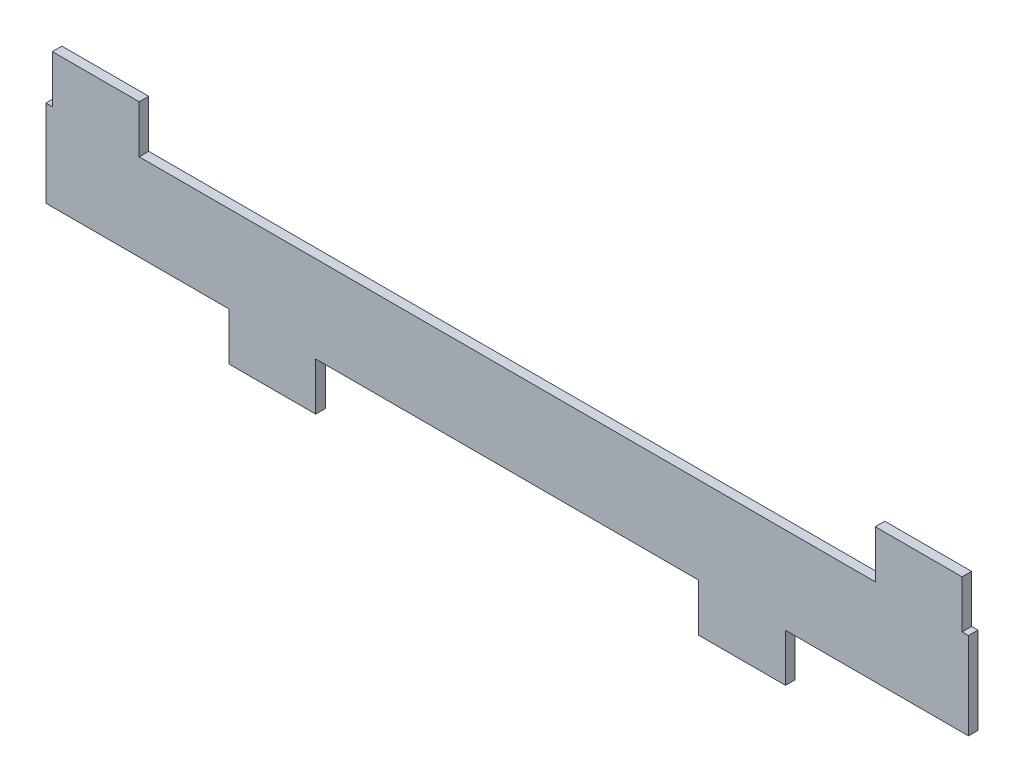
ISO-10303-21;
HEADER;
FILE_DESCRIPTION(('STEP AP214'),'2;1');
FILE_NAME('part.step','',(''),(''),'','','');
FILE_SCHEMA(('AUTOMOTIVE_DESIGN { 1 0 10303 214 1 1 1 1 }'));
ENDSEC;
DATA;
#1=APPLICATION_CONTEXT('core data for automotive mechanical design processes');
#2=APPLICATION_PROTOCOL_DEFINITION('international standard','automotive_design',2000,#1);
#3=PRODUCT_CONTEXT('',#1,'mechanical');
#4=PRODUCT('Part','Part','',(#3));
#5=PRODUCT_RELATED_PRODUCT_CATEGORY('part','',(#4));
#6=PRODUCT_DEFINITION_FORMATION('','',#4);
#7=PRODUCT_DEFINITION_CONTEXT('part definition',#1,'design');
#8=PRODUCT_DEFINITION('design','',#6,#7);
#9=PRODUCT_DEFINITION_SHAPE('','',#8);
#10=(LENGTH_UNIT() NAMED_UNIT(*) SI_UNIT(.MILLI.,.METRE.));
#11=(NAMED_UNIT(*) PLANE_ANGLE_UNIT() SI_UNIT($,.RADIAN.));
#12=(NAMED_UNIT(*) SI_UNIT($,.STERADIAN.) SOLID_ANGLE_UNIT());
#13=UNCERTAINTY_MEASURE_WITH_UNIT(LENGTH_MEASURE(1.E-05),#10,'distance_accuracy_value','');
#14=(GEOMETRIC_REPRESENTATION_CONTEXT(3) GLOBAL_UNCERTAINTY_ASSIGNED_CONTEXT((#13)) GLOBAL_UNIT_ASSIGNED_CONTEXT((#10,
#11,#12)) REPRESENTATION_CONTEXT('',''));
#15=CARTESIAN_POINT('',(0.,0.,0.));
#16=DIRECTION('',(0.,0.,1.));
#17=DIRECTION('',(1.,0.,0.));
#18=AXIS2_PLACEMENT_3D('',#15,#16,#17);
#19=CARTESIAN_POINT('',(64.6216856989642,114.1001191742,3.));
#20=DIRECTION('',(1.,0.,0.));
#21=DIRECTION('',(0.,0.,-1.));
#22=AXIS2_PLACEMENT_3D('',#19,#20,#21);
#23=PLANE('',#22);
#24=DIRECTION('',(0.,-1.,0.));
#25=VECTOR('',#24,1.);
#26=CARTESIAN_POINT('',(64.6216856989642,114.1001191742,0.));
#27=LINE('',#26,#25);
#28=CARTESIAN_POINT('',(64.6216856989642,114.1001191742,0.));
#29=VERTEX_POINT('',#28);
#30=CARTESIAN_POINT('',(64.6216856989642,99.1001191742,0.));
#31=VERTEX_POINT('',#30);
#32=EDGE_CURVE('E206',#29,#31,#27,.T.);
#33=ORIENTED_EDGE('',*,*,#32,.F.);
#34=DIRECTION('',(0.,0.,-1.));
#35=VECTOR('',#34,1.);
#36=CARTESIAN_POINT('',(64.6216856989642,114.1001191742,3.));
#37=LINE('',#36,#35);
#38=CARTESIAN_POINT('',(64.6216856989642,114.1001191742,3.));
#39=VERTEX_POINT('',#38);
#40=EDGE_CURVE('E11',#39,#29,#37,.T.);
#41=ORIENTED_EDGE('',*,*,#40,.F.);
#42=DIRECTION('',(0.,-1.,0.));
#43=VECTOR('',#42,1.);
#44=CARTESIAN_POINT('',(64.6216856989642,114.1001191742,3.));
#45=LINE('',#44,#43);
#46=CARTESIAN_POINT('',(64.6216856989642,99.1001191742,3.));
#47=VERTEX_POINT('',#46);
#48=EDGE_CURVE('E255',#39,#47,#45,.T.);
#49=ORIENTED_EDGE('',*,*,#48,.T.);
#50=DIRECTION('',(0.,0.,-1.));
#51=VECTOR('',#50,1.);
#52=CARTESIAN_POINT('',(64.6216856989642,99.1001191742,3.));
#53=LINE('',#52,#51);
#54=EDGE_CURVE('E39',#47,#31,#53,.T.);
#55=ORIENTED_EDGE('',*,*,#54,.T.);
#56=EDGE_LOOP('',(#33,#41,#49,#55));
#57=FACE_BOUND('',#56,.T.);
#58=ADVANCED_FACE('F36',(#57),#23,.T.);
#59=CARTESIAN_POINT('',(64.6216856989642,114.1001191742,3.));
#60=DIRECTION('',(0.,-1.,0.));
#61=DIRECTION('',(1.,0.,0.));
#62=AXIS2_PLACEMENT_3D('',#59,#60,#61);
#63=PLANE('',#62);
#64=DIRECTION('',(-1.,0.,0.));
#65=VECTOR('',#64,1.);
#66=CARTESIAN_POINT('',(64.6216856989642,114.1001191742,0.));
#67=LINE('',#66,#65);
#68=CARTESIAN_POINT('',(37.3216856989642,114.1001191742,0.));
#69=VERTEX_POINT('',#68);
#70=EDGE_CURVE('E117',#29,#69,#67,.T.);
#71=ORIENTED_EDGE('',*,*,#70,.T.);
#72=DIRECTION('',(0.,0.,-1.));
#73=VECTOR('',#72,1.);
#74=CARTESIAN_POINT('',(37.3216856989642,114.1001191742,3.));
#75=LINE('',#74,#73);
#76=CARTESIAN_POINT('',(37.3216856989642,114.1001191742,3.));
#77=VERTEX_POINT('',#76);
#78=EDGE_CURVE('E45',#77,#69,#75,.T.);
#79=ORIENTED_EDGE('',*,*,#78,.F.);
#80=DIRECTION('',(-1.,0.,0.));
#81=VECTOR('',#80,1.);
#82=CARTESIAN_POINT('',(64.6216856989642,114.1001191742,3.));
#83=LINE('',#82,#81);
#84=EDGE_CURVE('E184',#39,#77,#83,.T.);
#85=ORIENTED_EDGE('',*,*,#84,.F.);
#86=ORIENTED_EDGE('',*,*,#40,.T.);
#87=EDGE_LOOP('',(#71,#79,#85,#86));
#88=FACE_BOUND('',#87,.T.);
#89=ADVANCED_FACE('F407',(#88),#63,.F.);
#90=CARTESIAN_POINT('',(37.3216856989642,114.1001191742,3.));
#91=DIRECTION('',(1.,0.,0.));
#92=DIRECTION('',(0.,0.,-1.));
#93=AXIS2_PLACEMENT_3D('',#90,#91,#92);
#94=PLANE('',#93);
#95=DIRECTION('',(0.,-1.,0.));
#96=VECTOR('',#95,1.);
#97=CARTESIAN_POINT('',(37.3216856989642,114.1001191742,0.));
#98=LINE('',#97,#96);
#99=CARTESIAN_POINT('',(37.3216856989642,99.1001191742,0.));
#100=VERTEX_POINT('',#99);
#101=EDGE_CURVE('E191',#69,#100,#98,.T.);
#102=ORIENTED_EDGE('',*,*,#101,.T.);
#103=DIRECTION('',(0.,0.,-1.));
#104=VECTOR('',#103,1.);
#105=CARTESIAN_POINT('',(37.3216856989642,99.1001191742,3.));
#106=LINE('',#105,#104);
#107=CARTESIAN_POINT('',(37.3216856989642,99.1001191742,3.));
#108=VERTEX_POINT('',#107);
#109=EDGE_CURVE('E188',#108,#100,#106,.T.);
#110=ORIENTED_EDGE('',*,*,#109,.F.);
#111=DIRECTION('',(0.,-1.,0.));
#112=VECTOR('',#111,1.);
#113=CARTESIAN_POINT('',(37.3216856989642,114.1001191742,3.));
#114=LINE('',#113,#112);
#115=EDGE_CURVE('E177',#77,#108,#114,.T.);
#116=ORIENTED_EDGE('',*,*,#115,.F.);
#117=ORIENTED_EDGE('',*,*,#78,.T.);
#118=EDGE_LOOP('',(#102,#110,#116,#117));
#119=FACE_BOUND('',#118,.T.);
#120=ADVANCED_FACE('F189',(#119),#94,.F.);
#121=CARTESIAN_POINT('',(37.3216856989642,99.1001191742,3.));
#122=DIRECTION('',(0.,-1.,0.));
#123=DIRECTION('',(0.,0.,-1.));
#124=AXIS2_PLACEMENT_3D('',#121,#122,#123);
#125=PLANE('',#124);
#126=DIRECTION('',(-1.,0.,0.));
#127=VECTOR('',#126,1.);
#128=CARTESIAN_POINT('',(37.3216856989642,99.1001191742,0.));
#129=LINE('',#128,#127);
#130=CARTESIAN_POINT('',(35.3216856989642,99.1001191742,0.));
#131=VERTEX_POINT('',#130);
#132=EDGE_CURVE('E252',#100,#131,#129,.T.);
#133=ORIENTED_EDGE('',*,*,#132,.T.);
#134=DIRECTION('',(0.,0.,-1.));
#135=VECTOR('',#134,1.);
#136=CARTESIAN_POINT('',(35.3216856989642,99.1001191742,3.));
#137=LINE('',#136,#135);
#138=CARTESIAN_POINT('',(35.3216856989642,99.1001191742,3.));
#139=VERTEX_POINT('',#138);
#140=EDGE_CURVE('E194',#139,#131,#137,.T.);
#141=ORIENTED_EDGE('',*,*,#140,.F.);
#142=DIRECTION('',(-1.,0.,0.));
#143=VECTOR('',#142,1.);
#144=CARTESIAN_POINT('',(37.3216856989642,99.1001191742,3.));
#145=LINE('',#144,#143);
#146=EDGE_CURVE('E182',#108,#139,#145,.T.);
#147=ORIENTED_EDGE('',*,*,#146,.F.);
#148=ORIENTED_EDGE('',*,*,#109,.T.);
#149=EDGE_LOOP('',(#133,#141,#147,#148));
#150=FACE_BOUND('',#149,.T.);
#151=ADVANCED_FACE('F196',(#150),#125,.F.);
#152=CARTESIAN_POINT('',(35.3216856989642,99.1001191742,3.));
#153=DIRECTION('',(1.,0.,0.));
#154=DIRECTION('',(0.,0.,-1.));
#155=AXIS2_PLACEMENT_3D('',#152,#153,#154);
#156=PLANE('',#155);
#157=DIRECTION('',(0.,-1.,0.));
#158=VECTOR('',#157,1.);
#159=CARTESIAN_POINT('',(35.3216856989642,99.1001191742,0.));
#160=LINE('',#159,#158);
#161=CARTESIAN_POINT('',(35.3216856989642,71.8001191742,0.));
#162=VERTEX_POINT('',#161);
#163=EDGE_CURVE('E250',#131,#162,#160,.T.);
#164=ORIENTED_EDGE('',*,*,#163,.T.);
#165=DIRECTION('',(0.,0.,-1.));
#166=VECTOR('',#165,1.);
#167=CARTESIAN_POINT('',(35.3216856989642,71.8001191742,3.));
#168=LINE('',#167,#166);
#169=CARTESIAN_POINT('',(35.3216856989642,71.8001191742,3.));
#170=VERTEX_POINT('',#169);
#171=EDGE_CURVE('E259',#170,#162,#168,.T.);
#172=ORIENTED_EDGE('',*,*,#171,.F.);
#173=DIRECTION('',(0.,-1.,0.));
#174=VECTOR('',#173,1.);
#175=CARTESIAN_POINT('',(35.3216856989642,99.1001191742,3.));
#176=LINE('',#175,#174);
#177=EDGE_CURVE('E199',#139,#170,#176,.T.);
#178=ORIENTED_EDGE('',*,*,#177,.F.);
#179=ORIENTED_EDGE('',*,*,#140,.T.);
#180=EDGE_LOOP('',(#164,#172,#178,#179));
#181=FACE_BOUND('',#180,.T.);
#182=ADVANCED_FACE('F299',(#181),#156,.F.);
#183=CARTESIAN_POINT('',(35.3216856989642,71.8001191742,3.));
#184=DIRECTION('',(0.,1.,0.));
#185=DIRECTION('',(0.,0.,1.));
#186=AXIS2_PLACEMENT_3D('',#183,#184,#185);
#187=PLANE('',#186);
#188=DIRECTION('',(1.,0.,0.));
#189=VECTOR('',#188,1.);
#190=CARTESIAN_POINT('',(35.3216856989642,71.8001191742,0.));
#191=LINE('',#190,#189);
#192=CARTESIAN_POINT('',(92.8216856989642,71.8001191742,0.));
#193=VERTEX_POINT('',#192);
#194=EDGE_CURVE('E248',#162,#193,#191,.T.);
#195=ORIENTED_EDGE('',*,*,#194,.T.);
#196=DIRECTION('',(0.,0.,-1.));
#197=VECTOR('',#196,1.);
#198=CARTESIAN_POINT('',(92.8216856989642,71.8001191742,3.));
#199=LINE('',#198,#197);
#200=CARTESIAN_POINT('',(92.8216856989642,71.8001191742,3.));
#201=VERTEX_POINT('',#200);
#202=EDGE_CURVE('E262',#201,#193,#199,.T.);
#203=ORIENTED_EDGE('',*,*,#202,.F.);
#204=DIRECTION('',(1.,0.,0.));
#205=VECTOR('',#204,1.);
#206=CARTESIAN_POINT('',(35.3216856989642,71.8001191742,3.));
#207=LINE('',#206,#205);
#208=EDGE_CURVE('E201',#170,#201,#207,.T.);
#209=ORIENTED_EDGE('',*,*,#208,.F.);
#210=ORIENTED_EDGE('',*,*,#171,.T.);
#211=EDGE_LOOP('',(#195,#203,#209,#210));
#212=FACE_BOUND('',#211,.T.);
#213=ADVANCED_FACE('F307',(#212),#187,.F.);
#214=CARTESIAN_POINT('',(92.8216856989642,71.8001191742,3.));
#215=DIRECTION('',(1.,0.,0.));
#216=DIRECTION('',(0.,0.,-1.));
#217=AXIS2_PLACEMENT_3D('',#214,#215,#216);
#218=PLANE('',#217);
#219=DIRECTION('',(0.,-1.,0.));
#220=VECTOR('',#219,1.);
#221=CARTESIAN_POINT('',(92.8216856989642,71.8001191742,0.));
#222=LINE('',#221,#220);
#223=CARTESIAN_POINT('',(92.8216856989642,56.8001191742,0.));
#224=VERTEX_POINT('',#223);
#225=EDGE_CURVE('E246',#193,#224,#222,.T.);
#226=ORIENTED_EDGE('',*,*,#225,.T.);
#227=DIRECTION('',(0.,0.,-1.));
#228=VECTOR('',#227,1.);
#229=CARTESIAN_POINT('',(92.8216856989642,56.8001191742,3.));
#230=LINE('',#229,#228);
#231=CARTESIAN_POINT('',(92.8216856989642,56.8001191742,3.));
#232=VERTEX_POINT('',#231);
#233=EDGE_CURVE('E265',#232,#224,#230,.T.);
#234=ORIENTED_EDGE('',*,*,#233,.F.);
#235=DIRECTION('',(0.,-1.,0.));
#236=VECTOR('',#235,1.);
#237=CARTESIAN_POINT('',(92.8216856989642,71.8001191742,3.));
#238=LINE('',#237,#236);
#239=EDGE_CURVE('E304',#201,#232,#238,.T.);
#240=ORIENTED_EDGE('',*,*,#239,.F.);
#241=ORIENTED_EDGE('',*,*,#202,.T.);
#242=EDGE_LOOP('',(#226,#234,#240,#241));
#243=FACE_BOUND('',#242,.T.);
#244=ADVANCED_FACE('F310',(#243),#218,.F.);
#245=CARTESIAN_POINT('',(92.8216856989642,56.8001191742,3.));
#246=DIRECTION('',(0.,1.,0.));
#247=DIRECTION('',(0.,0.,1.));
#248=AXIS2_PLACEMENT_3D('',#245,#246,#247);
#249=PLANE('',#248);
#250=DIRECTION('',(1.,0.,0.));
#251=VECTOR('',#250,1.);
#252=CARTESIAN_POINT('',(92.8216856989642,56.8001191742,0.));
#253=LINE('',#252,#251);
#254=CARTESIAN_POINT('',(120.121685698964,56.8001191742,0.));
#255=VERTEX_POINT('',#254);
#256=EDGE_CURVE('E244',#224,#255,#253,.T.);
#257=ORIENTED_EDGE('',*,*,#256,.T.);
#258=DIRECTION('',(0.,0.,-1.));
#259=VECTOR('',#258,1.);
#260=CARTESIAN_POINT('',(120.121685698964,56.8001191742,3.));
#261=LINE('',#260,#259);
#262=CARTESIAN_POINT('',(120.121685698964,56.8001191742,3.));
#263=VERTEX_POINT('',#262);
#264=EDGE_CURVE('E268',#263,#255,#261,.T.);
#265=ORIENTED_EDGE('',*,*,#264,.F.);
#266=DIRECTION('',(1.,0.,0.));
#267=VECTOR('',#266,1.);
#268=CARTESIAN_POINT('',(92.8216856989642,56.8001191742,3.));
#269=LINE('',#268,#267);
#270=EDGE_CURVE('E312',#232,#263,#269,.T.);
#271=ORIENTED_EDGE('',*,*,#270,.F.);
#272=ORIENTED_EDGE('',*,*,#233,.T.);
#273=EDGE_LOOP('',(#257,#265,#271,#272));
#274=FACE_BOUND('',#273,.T.);
#275=ADVANCED_FACE('F396',(#274),#249,.F.);
#276=CARTESIAN_POINT('',(120.121685698964,56.8001191742,3.));
#277=DIRECTION('',(-1.,0.,0.));
#278=DIRECTION('',(0.,0.,1.));
#279=AXIS2_PLACEMENT_3D('',#276,#277,#278);
#280=PLANE('',#279);
#281=DIRECTION('',(0.,1.,0.));
#282=VECTOR('',#281,1.);
#283=CARTESIAN_POINT('',(120.121685698964,56.8001191742,0.));
#284=LINE('',#283,#282);
#285=CARTESIAN_POINT('',(120.121685698964,71.8001191742,0.));
#286=VERTEX_POINT('',#285);
#287=EDGE_CURVE('E242',#255,#286,#284,.T.);
#288=ORIENTED_EDGE('',*,*,#287,.T.);
#289=DIRECTION('',(0.,0.,-1.));
#290=VECTOR('',#289,1.);
#291=CARTESIAN_POINT('',(120.121685698964,71.8001191742,3.));
#292=LINE('',#291,#290);
#293=CARTESIAN_POINT('',(120.121685698964,71.8001191742,3.));
#294=VERTEX_POINT('',#293);
#295=EDGE_CURVE('E271',#294,#286,#292,.T.);
#296=ORIENTED_EDGE('',*,*,#295,.F.);
#297=DIRECTION('',(0.,1.,0.));
#298=VECTOR('',#297,1.);
#299=CARTESIAN_POINT('',(120.121685698964,56.8001191742,3.));
#300=LINE('',#299,#298);
#301=EDGE_CURVE('E314',#263,#294,#300,.T.);
#302=ORIENTED_EDGE('',*,*,#301,.F.);
#303=ORIENTED_EDGE('',*,*,#264,.T.);
#304=EDGE_LOOP('',(#288,#296,#302,#303));
#305=FACE_BOUND('',#304,.T.);
#306=ADVANCED_FACE('F392',(#305),#280,.F.);
#307=CARTESIAN_POINT('',(120.121685698964,71.8001191742,3.));
#308=DIRECTION('',(0.,1.,0.));
#309=DIRECTION('',(-1.,0.,0.));
#310=AXIS2_PLACEMENT_3D('',#307,#308,#309);
#311=PLANE('',#310);
#312=DIRECTION('',(1.,0.,0.));
#313=VECTOR('',#312,1.);
#314=CARTESIAN_POINT('',(120.121685698964,71.8001191742,0.));
#315=LINE('',#314,#313);
#316=CARTESIAN_POINT('',(240.521685698964,71.8001191742,0.));
#317=VERTEX_POINT('',#316);
#318=EDGE_CURVE('E239',#286,#317,#315,.T.);
#319=ORIENTED_EDGE('',*,*,#318,.T.);
#320=DIRECTION('',(0.,0.,-1.));
#321=VECTOR('',#320,1.);
#322=CARTESIAN_POINT('',(240.521685698964,71.8001191742,3.));
#323=LINE('',#322,#321);
#324=CARTESIAN_POINT('',(240.521685698964,71.8001191742,3.));
#325=VERTEX_POINT('',#324);
#326=EDGE_CURVE('E274',#325,#317,#323,.T.);
#327=ORIENTED_EDGE('',*,*,#326,.F.);
#328=DIRECTION('',(1.,0.,0.));
#329=VECTOR('',#328,1.);
#330=CARTESIAN_POINT('',(120.121685698964,71.8001191742,3.));
#331=LINE('',#330,#329);
#332=EDGE_CURVE('E318',#294,#325,#331,.T.);
#333=ORIENTED_EDGE('',*,*,#332,.F.);
#334=ORIENTED_EDGE('',*,*,#295,.T.);
#335=EDGE_LOOP('',(#319,#327,#333,#334));
#336=FACE_BOUND('',#335,.T.);
#337=ADVANCED_FACE('F387',(#336),#311,.F.);
#338=CARTESIAN_POINT('',(240.521685698964,56.8001191742,3.));
#339=DIRECTION('',(-1.,0.,0.));
#340=DIRECTION('',(0.,0.,1.));
#341=AXIS2_PLACEMENT_3D('',#338,#339,#340);
#342=PLANE('',#341);
#343=DIRECTION('',(0.,1.,0.));
#344=VECTOR('',#343,1.);
#345=CARTESIAN_POINT('',(240.521685698964,56.8001191742,0.));
#346=LINE('',#345,#344);
#347=CARTESIAN_POINT('',(240.521685698964,56.8001191742,0.));
#348=VERTEX_POINT('',#347);
#349=EDGE_CURVE('E236',#348,#317,#346,.T.);
#350=ORIENTED_EDGE('',*,*,#349,.F.);
#351=DIRECTION('',(0.,0.,-1.));
#352=VECTOR('',#351,1.);
#353=CARTESIAN_POINT('',(240.521685698964,56.8001191742,3.));
#354=LINE('',#353,#352);
#355=CARTESIAN_POINT('',(240.521685698964,56.8001191742,3.));
#356=VERTEX_POINT('',#355);
#357=EDGE_CURVE('E276',#356,#348,#354,.T.);
#358=ORIENTED_EDGE('',*,*,#357,.F.);
#359=DIRECTION('',(0.,1.,0.));
#360=VECTOR('',#359,1.);
#361=CARTESIAN_POINT('',(240.521685698964,56.8001191742,3.));
#362=LINE('',#361,#360);
#363=EDGE_CURVE('E320',#356,#325,#362,.T.);
#364=ORIENTED_EDGE('',*,*,#363,.T.);
#365=ORIENTED_EDGE('',*,*,#326,.T.);
#366=EDGE_LOOP('',(#350,#358,#364,#365));
#367=FACE_BOUND('',#366,.T.);
#368=ADVANCED_FACE('F383',(#367),#342,.T.);
#369=CARTESIAN_POINT('',(267.821685698964,56.8001191742,3.));
#370=DIRECTION('',(0.,-1.,0.));
#371=DIRECTION('',(0.,0.,-1.));
#372=AXIS2_PLACEMENT_3D('',#369,#370,#371);
#373=PLANE('',#372);
#374=DIRECTION('',(-1.,0.,0.));
#375=VECTOR('',#374,1.);
#376=CARTESIAN_POINT('',(267.821685698964,56.8001191742,0.));
#377=LINE('',#376,#375);
#378=CARTESIAN_POINT('',(267.821685698964,56.8001191742,0.));
#379=VERTEX_POINT('',#378);
#380=EDGE_CURVE('E233',#379,#348,#377,.T.);
#381=ORIENTED_EDGE('',*,*,#380,.F.);
#382=DIRECTION('',(0.,0.,-1.));
#383=VECTOR('',#382,1.);
#384=CARTESIAN_POINT('',(267.821685698964,56.8001191742,3.));
#385=LINE('',#384,#383);
#386=CARTESIAN_POINT('',(267.821685698964,56.8001191742,3.));
#387=VERTEX_POINT('',#386);
#388=EDGE_CURVE('E278',#387,#379,#385,.T.);
#389=ORIENTED_EDGE('',*,*,#388,.F.);
#390=DIRECTION('',(-1.,0.,0.));
#391=VECTOR('',#390,1.);
#392=CARTESIAN_POINT('',(267.821685698964,56.8001191742,3.));
#393=LINE('',#392,#391);
#394=EDGE_CURVE('E323',#387,#356,#393,.T.);
#395=ORIENTED_EDGE('',*,*,#394,.T.);
#396=ORIENTED_EDGE('',*,*,#357,.T.);
#397=EDGE_LOOP('',(#381,#389,#395,#396));
#398=FACE_BOUND('',#397,.T.);
#399=ADVANCED_FACE('F379',(#398),#373,.T.);
#400=CARTESIAN_POINT('',(267.821685698964,71.8001191742,3.));
#401=DIRECTION('',(1.,0.,0.));
#402=DIRECTION('',(0.,0.,-1.));
#403=AXIS2_PLACEMENT_3D('',#400,#401,#402);
#404=PLANE('',#403);
#405=DIRECTION('',(0.,-1.,0.));
#406=VECTOR('',#405,1.);
#407=CARTESIAN_POINT('',(267.821685698964,71.8001191742,0.));
#408=LINE('',#407,#406);
#409=CARTESIAN_POINT('',(267.821685698964,71.8001191742,0.));
#410=VERTEX_POINT('',#409);
#411=EDGE_CURVE('E230',#410,#379,#408,.T.);
#412=ORIENTED_EDGE('',*,*,#411,.F.);
#413=DIRECTION('',(0.,0.,-1.));
#414=VECTOR('',#413,1.);
#415=CARTESIAN_POINT('',(267.821685698964,71.8001191742,3.));
#416=LINE('',#415,#414);
#417=CARTESIAN_POINT('',(267.821685698964,71.8001191742,3.));
#418=VERTEX_POINT('',#417);
#419=EDGE_CURVE('E280',#418,#410,#416,.T.);
#420=ORIENTED_EDGE('',*,*,#419,.F.);
#421=DIRECTION('',(0.,-1.,0.));
#422=VECTOR('',#421,1.);
#423=CARTESIAN_POINT('',(267.821685698964,71.8001191742,3.));
#424=LINE('',#423,#422);
#425=EDGE_CURVE('E326',#418,#387,#424,.T.);
#426=ORIENTED_EDGE('',*,*,#425,.T.);
#427=ORIENTED_EDGE('',*,*,#388,.T.);
#428=EDGE_LOOP('',(#412,#420,#426,#427));
#429=FACE_BOUND('',#428,.T.);
#430=ADVANCED_FACE('F374',(#429),#404,.T.);
#431=CARTESIAN_POINT('',(325.321685698964,71.8001191742,3.));
#432=DIRECTION('',(0.,-1.,0.));
#433=DIRECTION('',(1.,0.,0.));
#434=AXIS2_PLACEMENT_3D('',#431,#432,#433);
#435=PLANE('',#434);
#436=DIRECTION('',(-1.,0.,0.));
#437=VECTOR('',#436,1.);
#438=CARTESIAN_POINT('',(325.321685698964,71.8001191742,0.));
#439=LINE('',#438,#437);
#440=CARTESIAN_POINT('',(325.321685698964,71.8001191742,0.));
#441=VERTEX_POINT('',#440);
#442=EDGE_CURVE('E227',#441,#410,#439,.T.);
#443=ORIENTED_EDGE('',*,*,#442,.F.);
#444=DIRECTION('',(0.,0.,-1.));
#445=VECTOR('',#444,1.);
#446=CARTESIAN_POINT('',(325.321685698964,71.8001191742,3.));
#447=LINE('',#446,#445);
#448=CARTESIAN_POINT('',(325.321685698964,71.8001191742,3.));
#449=VERTEX_POINT('',#448);
#450=EDGE_CURVE('E282',#449,#441,#447,.T.);
#451=ORIENTED_EDGE('',*,*,#450,.F.);
#452=DIRECTION('',(-1.,0.,0.));
#453=VECTOR('',#452,1.);
#454=CARTESIAN_POINT('',(325.321685698964,71.8001191742,3.));
#455=LINE('',#454,#453);
#456=EDGE_CURVE('E329',#449,#418,#455,.T.);
#457=ORIENTED_EDGE('',*,*,#456,.T.);
#458=ORIENTED_EDGE('',*,*,#419,.T.);
#459=EDGE_LOOP('',(#443,#451,#457,#458));
#460=FACE_BOUND('',#459,.T.);
#461=ADVANCED_FACE('F368',(#460),#435,.T.);
#462=CARTESIAN_POINT('',(325.321685698964,71.8001191742,3.));
#463=DIRECTION('',(-1.,0.,0.));
#464=DIRECTION('',(0.,0.,1.));
#465=AXIS2_PLACEMENT_3D('',#462,#463,#464);
#466=PLANE('',#465);
#467=DIRECTION('',(0.,1.,0.));
#468=VECTOR('',#467,1.);
#469=CARTESIAN_POINT('',(325.321685698964,71.8001191742,0.));
#470=LINE('',#469,#468);
#471=CARTESIAN_POINT('',(325.321685698964,99.1001191742,0.));
#472=VERTEX_POINT('',#471);
#473=EDGE_CURVE('E224',#441,#472,#470,.T.);
#474=ORIENTED_EDGE('',*,*,#473,.T.);
#475=DIRECTION('',(0.,0.,-1.));
#476=VECTOR('',#475,1.);
#477=CARTESIAN_POINT('',(325.321685698964,99.1001191742,3.));
#478=LINE('',#477,#476);
#479=CARTESIAN_POINT('',(325.321685698964,99.1001191742,3.));
#480=VERTEX_POINT('',#479);
#481=EDGE_CURVE('E284',#480,#472,#478,.T.);
#482=ORIENTED_EDGE('',*,*,#481,.F.);
#483=DIRECTION('',(0.,1.,0.));
#484=VECTOR('',#483,1.);
#485=CARTESIAN_POINT('',(325.321685698964,71.8001191742,3.));
#486=LINE('',#485,#484);
#487=EDGE_CURVE('E332',#449,#480,#486,.T.);
#488=ORIENTED_EDGE('',*,*,#487,.F.);
#489=ORIENTED_EDGE('',*,*,#450,.T.);
#490=EDGE_LOOP('',(#474,#482,#488,#489));
#491=FACE_BOUND('',#490,.T.);
#492=ADVANCED_FACE('F397',(#491),#466,.F.);
#493=CARTESIAN_POINT('',(323.321685698964,99.1001191742,3.));
#494=DIRECTION('',(0.,1.,0.));
#495=DIRECTION('',(0.,0.,1.));
#496=AXIS2_PLACEMENT_3D('',#493,#494,#495);
#497=PLANE('',#496);
#498=DIRECTION('',(1.,0.,0.));
#499=VECTOR('',#498,1.);
#500=CARTESIAN_POINT('',(323.321685698964,99.1001191742,0.));
#501=LINE('',#500,#499);
#502=CARTESIAN_POINT('',(323.321685698964,99.1001191742,0.));
#503=VERTEX_POINT('',#502);
#504=EDGE_CURVE('E221',#503,#472,#501,.T.);
#505=ORIENTED_EDGE('',*,*,#504,.F.);
#506=DIRECTION('',(0.,0.,-1.));
#507=VECTOR('',#506,1.);
#508=CARTESIAN_POINT('',(323.321685698964,99.1001191742,3.));
#509=LINE('',#508,#507);
#510=CARTESIAN_POINT('',(323.321685698964,99.1001191742,3.));
#511=VERTEX_POINT('',#510);
#512=EDGE_CURVE('E286',#511,#503,#509,.T.);
#513=ORIENTED_EDGE('',*,*,#512,.F.);
#514=DIRECTION('',(1.,0.,0.));
#515=VECTOR('',#514,1.);
#516=CARTESIAN_POINT('',(323.321685698964,99.1001191742,3.));
#517=LINE('',#516,#515);
#518=EDGE_CURVE('E334',#511,#480,#517,.T.);
#519=ORIENTED_EDGE('',*,*,#518,.T.);
#520=ORIENTED_EDGE('',*,*,#481,.T.);
#521=EDGE_LOOP('',(#505,#513,#519,#520));
#522=FACE_BOUND('',#521,.T.);
#523=ADVANCED_FACE('F362',(#522),#497,.T.);
#524=CARTESIAN_POINT('',(323.321685698964,99.1001191742,3.));
#525=DIRECTION('',(-1.,0.,0.));
#526=DIRECTION('',(0.,0.,1.));
#527=AXIS2_PLACEMENT_3D('',#524,#525,#526);
#528=PLANE('',#527);
#529=DIRECTION('',(0.,1.,0.));
#530=VECTOR('',#529,1.);
#531=CARTESIAN_POINT('',(323.321685698964,99.1001191742,0.));
#532=LINE('',#531,#530);
#533=CARTESIAN_POINT('',(323.321685698964,114.1001191742,0.));
#534=VERTEX_POINT('',#533);
#535=EDGE_CURVE('E218',#503,#534,#532,.T.);
#536=ORIENTED_EDGE('',*,*,#535,.T.);
#537=DIRECTION('',(0.,0.,-1.));
#538=VECTOR('',#537,1.);
#539=CARTESIAN_POINT('',(323.321685698964,114.1001191742,3.));
#540=LINE('',#539,#538);
#541=CARTESIAN_POINT('',(323.321685698964,114.1001191742,3.));
#542=VERTEX_POINT('',#541);
#543=EDGE_CURVE('E288',#542,#534,#540,.T.);
#544=ORIENTED_EDGE('',*,*,#543,.F.);
#545=DIRECTION('',(0.,1.,0.));
#546=VECTOR('',#545,1.);
#547=CARTESIAN_POINT('',(323.321685698964,99.1001191742,3.));
#548=LINE('',#547,#546);
#549=EDGE_CURVE('E337',#511,#542,#548,.T.);
#550=ORIENTED_EDGE('',*,*,#549,.F.);
#551=ORIENTED_EDGE('',*,*,#512,.T.);
#552=EDGE_LOOP('',(#536,#544,#550,#551));
#553=FACE_BOUND('',#552,.T.);
#554=ADVANCED_FACE('F359',(#553),#528,.F.);
#555=CARTESIAN_POINT('',(296.021685698964,114.1001191742,3.));
#556=DIRECTION('',(0.,1.,0.));
#557=DIRECTION('',(0.,0.,1.));
#558=AXIS2_PLACEMENT_3D('',#555,#556,#557);
#559=PLANE('',#558);
#560=DIRECTION('',(1.,0.,0.));
#561=VECTOR('',#560,1.);
#562=CARTESIAN_POINT('',(296.021685698964,114.1001191742,0.));
#563=LINE('',#562,#561);
#564=CARTESIAN_POINT('',(296.021685698964,114.1001191742,0.));
#565=VERTEX_POINT('',#564);
#566=EDGE_CURVE('E215',#565,#534,#563,.T.);
#567=ORIENTED_EDGE('',*,*,#566,.F.);
#568=DIRECTION('',(0.,0.,-1.));
#569=VECTOR('',#568,1.);
#570=CARTESIAN_POINT('',(296.021685698964,114.1001191742,3.));
#571=LINE('',#570,#569);
#572=CARTESIAN_POINT('',(296.021685698964,114.1001191742,3.));
#573=VERTEX_POINT('',#572);
#574=EDGE_CURVE('E290',#573,#565,#571,.T.);
#575=ORIENTED_EDGE('',*,*,#574,.F.);
#576=DIRECTION('',(1.,0.,0.));
#577=VECTOR('',#576,1.);
#578=CARTESIAN_POINT('',(296.021685698964,114.1001191742,3.));
#579=LINE('',#578,#577);
#580=EDGE_CURVE('E339',#573,#542,#579,.T.);
#581=ORIENTED_EDGE('',*,*,#580,.T.);
#582=ORIENTED_EDGE('',*,*,#543,.T.);
#583=EDGE_LOOP('',(#567,#575,#581,#582));
#584=FACE_BOUND('',#583,.T.);
#585=ADVANCED_FACE('F355',(#584),#559,.T.);
#586=CARTESIAN_POINT('',(296.021685698964,99.1001191742,3.));
#587=DIRECTION('',(-1.,0.,0.));
#588=DIRECTION('',(0.,0.,1.));
#589=AXIS2_PLACEMENT_3D('',#586,#587,#588);
#590=PLANE('',#589);
#591=DIRECTION('',(0.,1.,0.));
#592=VECTOR('',#591,1.);
#593=CARTESIAN_POINT('',(296.021685698964,99.1001191742,0.));
#594=LINE('',#593,#592);
#595=CARTESIAN_POINT('',(296.021685698964,99.1001191742,0.));
#596=VERTEX_POINT('',#595);
#597=EDGE_CURVE('E212',#596,#565,#594,.T.);
#598=ORIENTED_EDGE('',*,*,#597,.F.);
#599=DIRECTION('',(0.,0.,-1.));
#600=VECTOR('',#599,1.);
#601=CARTESIAN_POINT('',(296.021685698964,99.1001191742,3.));
#602=LINE('',#601,#600);
#603=CARTESIAN_POINT('',(296.021685698964,99.1001191742,3.));
#604=VERTEX_POINT('',#603);
#605=EDGE_CURVE('E291',#604,#596,#602,.T.);
#606=ORIENTED_EDGE('',*,*,#605,.F.);
#607=DIRECTION('',(0.,1.,0.));
#608=VECTOR('',#607,1.);
#609=CARTESIAN_POINT('',(296.021685698964,99.1001191742,3.));
#610=LINE('',#609,#608);
#611=EDGE_CURVE('E342',#604,#573,#610,.T.);
#612=ORIENTED_EDGE('',*,*,#611,.T.);
#613=ORIENTED_EDGE('',*,*,#574,.T.);
#614=EDGE_LOOP('',(#598,#606,#612,#613));
#615=FACE_BOUND('',#614,.T.);
#616=ADVANCED_FACE('F350',(#615),#590,.T.);
#617=CARTESIAN_POINT('',(64.6216856989642,99.1001191742,3.));
#618=DIRECTION('',(0.,1.,0.));
#619=DIRECTION('',(0.,0.,1.));
#620=AXIS2_PLACEMENT_3D('',#617,#618,#619);
#621=PLANE('',#620);
#622=DIRECTION('',(1.,0.,0.));
#623=VECTOR('',#622,1.);
#624=CARTESIAN_POINT('',(64.6216856989642,99.1001191742,0.));
#625=LINE('',#624,#623);
#626=EDGE_CURVE('E209',#31,#596,#625,.T.);
#627=ORIENTED_EDGE('',*,*,#626,.F.);
#628=ORIENTED_EDGE('',*,*,#54,.F.);
#629=DIRECTION('',(1.,0.,0.));
#630=VECTOR('',#629,1.);
#631=CARTESIAN_POINT('',(64.6216856989642,99.1001191742,3.));
#632=LINE('',#631,#630);
#633=EDGE_CURVE('E345',#47,#604,#632,.T.);
#634=ORIENTED_EDGE('',*,*,#633,.T.);
#635=ORIENTED_EDGE('',*,*,#605,.T.);
#636=EDGE_LOOP('',(#627,#628,#634,#635));
#637=FACE_BOUND('',#636,.T.);
#638=ADVANCED_FACE('F293',(#637),#621,.T.);
#639=CARTESIAN_POINT('',(0.,0.,3.));
#640=DIRECTION('',(0.,0.,1.));
#641=DIRECTION('',(1.,0.,0.));
#642=AXIS2_PLACEMENT_3D('',#639,#640,#641);
#643=PLANE('',#642);
#644=ORIENTED_EDGE('',*,*,#48,.F.);
#645=ORIENTED_EDGE('',*,*,#84,.T.);
#646=ORIENTED_EDGE('',*,*,#115,.T.);
#647=ORIENTED_EDGE('',*,*,#146,.T.);
#648=ORIENTED_EDGE('',*,*,#177,.T.);
#649=ORIENTED_EDGE('',*,*,#208,.T.);
#650=ORIENTED_EDGE('',*,*,#239,.T.);
#651=ORIENTED_EDGE('',*,*,#270,.T.);
#652=ORIENTED_EDGE('',*,*,#301,.T.);
#653=ORIENTED_EDGE('',*,*,#332,.T.);
#654=ORIENTED_EDGE('',*,*,#363,.F.);
#655=ORIENTED_EDGE('',*,*,#394,.F.);
#656=ORIENTED_EDGE('',*,*,#425,.F.);
#657=ORIENTED_EDGE('',*,*,#456,.F.);
#658=ORIENTED_EDGE('',*,*,#487,.T.);
#659=ORIENTED_EDGE('',*,*,#518,.F.);
#660=ORIENTED_EDGE('',*,*,#549,.T.);
#661=ORIENTED_EDGE('',*,*,#580,.F.);
#662=ORIENTED_EDGE('',*,*,#611,.F.);
#663=ORIENTED_EDGE('',*,*,#633,.F.);
#664=EDGE_LOOP('',(#644,#645,#646,#647,#648,#649,#650,#651,#652,#653,#654,#655,#656,#657,#658,
#659,#660,#661,#662,#663));
#665=FACE_BOUND('',#664,.T.);
#666=ADVANCED_FACE('F180',(#665),#643,.T.);
#667=CARTESIAN_POINT('',(0.,0.,0.));
#668=DIRECTION('',(0.,0.,1.));
#669=DIRECTION('',(1.,0.,0.));
#670=AXIS2_PLACEMENT_3D('',#667,#668,#669);
#671=PLANE('',#670);
#672=ORIENTED_EDGE('',*,*,#32,.T.);
#673=ORIENTED_EDGE('',*,*,#626,.T.);
#674=ORIENTED_EDGE('',*,*,#597,.T.);
#675=ORIENTED_EDGE('',*,*,#566,.T.);
#676=ORIENTED_EDGE('',*,*,#535,.F.);
#677=ORIENTED_EDGE('',*,*,#504,.T.);
#678=ORIENTED_EDGE('',*,*,#473,.F.);
#679=ORIENTED_EDGE('',*,*,#442,.T.);
#680=ORIENTED_EDGE('',*,*,#411,.T.);
#681=ORIENTED_EDGE('',*,*,#380,.T.);
#682=ORIENTED_EDGE('',*,*,#349,.T.);
#683=ORIENTED_EDGE('',*,*,#318,.F.);
#684=ORIENTED_EDGE('',*,*,#287,.F.);
#685=ORIENTED_EDGE('',*,*,#256,.F.);
#686=ORIENTED_EDGE('',*,*,#225,.F.);
#687=ORIENTED_EDGE('',*,*,#194,.F.);
#688=ORIENTED_EDGE('',*,*,#163,.F.);
#689=ORIENTED_EDGE('',*,*,#132,.F.);
#690=ORIENTED_EDGE('',*,*,#101,.F.);
#691=ORIENTED_EDGE('',*,*,#70,.F.);
#692=EDGE_LOOP('',(#672,#673,#674,#675,#676,#677,#678,#679,#680,#681,#682,#683,#684,#685,#686,
#687,#688,#689,#690,#691));
#693=FACE_BOUND('',#692,.T.);
#694=ADVANCED_FACE('F295',(#693),#671,.F.);
#695=CLOSED_SHELL('',(#58,#89,#120,#151,#182,#213,#244,#275,#306,#337,#368,#399,#430,#461,#492,
#523,#554,#585,#616,#638,#666,#694));
#696=MANIFOLD_SOLID_BREP('B2',#695);
#697=ADVANCED_BREP_SHAPE_REPRESENTATION('',(#18,#696),#14);
#698=SHAPE_DEFINITION_REPRESENTATION(#9,#697);
ENDSEC;
END-ISO-10303-21;
